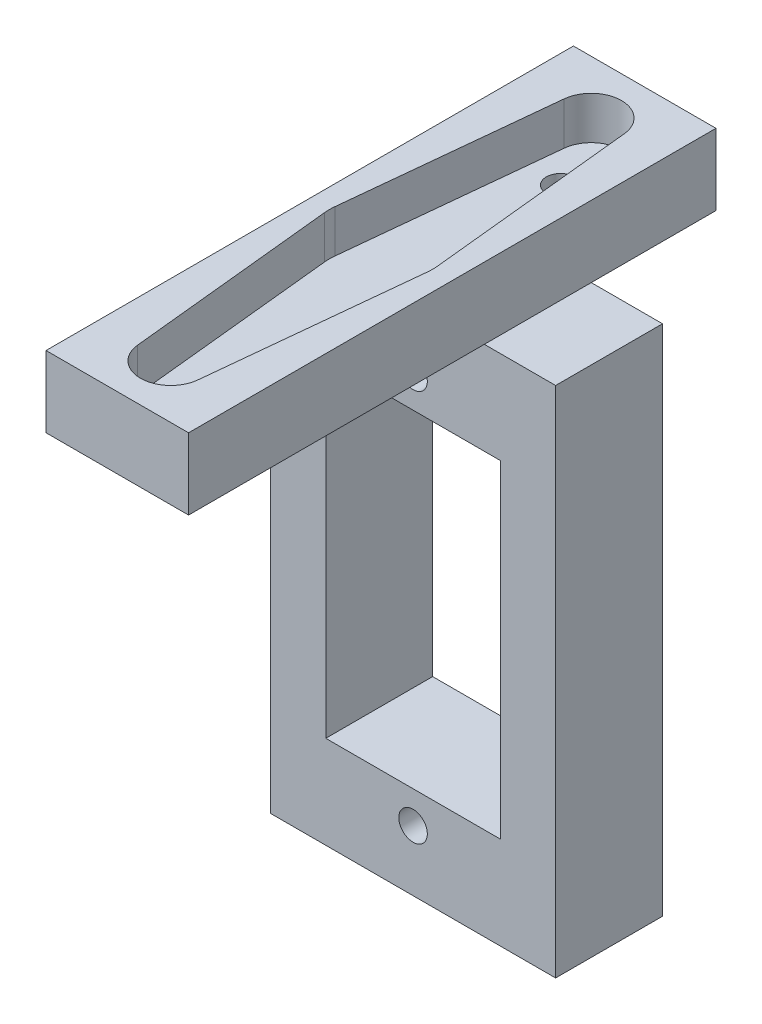
ISO-10303-21;
HEADER;
FILE_DESCRIPTION(('STEP AP214'),'2;1');
FILE_NAME('part.step','',(''),(''),'','','');
FILE_SCHEMA(('AUTOMOTIVE_DESIGN { 1 0 10303 214 1 1 1 1 }'));
ENDSEC;
DATA;
#1=APPLICATION_CONTEXT('core data for automotive mechanical design processes');
#2=APPLICATION_PROTOCOL_DEFINITION('international standard','automotive_design',2000,#1);
#3=PRODUCT_CONTEXT('',#1,'mechanical');
#4=PRODUCT('Part','Part','',(#3));
#5=PRODUCT_RELATED_PRODUCT_CATEGORY('part','',(#4));
#6=PRODUCT_DEFINITION_FORMATION('','',#4);
#7=PRODUCT_DEFINITION_CONTEXT('part definition',#1,'design');
#8=PRODUCT_DEFINITION('design','',#6,#7);
#9=PRODUCT_DEFINITION_SHAPE('','',#8);
#10=(LENGTH_UNIT() NAMED_UNIT(*) SI_UNIT(.MILLI.,.METRE.));
#11=(NAMED_UNIT(*) PLANE_ANGLE_UNIT() SI_UNIT($,.RADIAN.));
#12=(NAMED_UNIT(*) SI_UNIT($,.STERADIAN.) SOLID_ANGLE_UNIT());
#13=UNCERTAINTY_MEASURE_WITH_UNIT(LENGTH_MEASURE(1.E-05),#10,'distance_accuracy_value','');
#14=(GEOMETRIC_REPRESENTATION_CONTEXT(3) GLOBAL_UNCERTAINTY_ASSIGNED_CONTEXT((#13)) GLOBAL_UNIT_ASSIGNED_CONTEXT((#10,
#11,#12)) REPRESENTATION_CONTEXT('',''));
#15=CARTESIAN_POINT('',(0.,0.,0.));
#16=DIRECTION('',(0.,0.,1.));
#17=DIRECTION('',(1.,0.,0.));
#18=AXIS2_PLACEMENT_3D('',#15,#16,#17);
#19=CARTESIAN_POINT('',(0.,-5.,0.));
#20=DIRECTION('',(0.,1.,0.));
#21=DIRECTION('',(0.,0.,1.));
#22=AXIS2_PLACEMENT_3D('',#19,#20,#21);
#23=PLANE('',#22);
#24=CARTESIAN_POINT('',(0.,-5.,-12.6));
#25=DIRECTION('',(0.,1.,0.));
#26=DIRECTION('',(0.,0.,1.));
#27=AXIS2_PLACEMENT_3D('',#24,#25,#26);
#28=CIRCLE('',#27,1.);
#29=CARTESIAN_POINT('',(0.,-5.,-11.6));
#30=VERTEX_POINT('',#29);
#31=EDGE_CURVE('E679',#30,#30,#28,.F.);
#32=ORIENTED_EDGE('',*,*,#31,.F.);
#33=EDGE_LOOP('',(#32));
#34=FACE_BOUND('',#33,.T.);
#35=DIRECTION('',(1.,0.,0.));
#36=VECTOR('',#35,1.);
#37=CARTESIAN_POINT('',(-10.,-5.,-9.75));
#38=LINE('',#37,#36);
#39=CARTESIAN_POINT('',(-5.,-5.,-9.75));
#40=VERTEX_POINT('',#39);
#41=CARTESIAN_POINT('',(5.,-5.,-9.75));
#42=VERTEX_POINT('',#41);
#43=EDGE_CURVE('E236',#40,#42,#38,.T.);
#44=ORIENTED_EDGE('',*,*,#43,.F.);
#45=DIRECTION('',(0.,0.,1.));
#46=VECTOR('',#45,1.);
#47=CARTESIAN_POINT('',(-5.,-5.,-18.5));
#48=LINE('',#47,#46);
#49=CARTESIAN_POINT('',(-5.,-5.,-18.5));
#50=VERTEX_POINT('',#49);
#51=EDGE_CURVE('E322',#50,#40,#48,.T.);
#52=ORIENTED_EDGE('',*,*,#51,.F.);
#53=DIRECTION('',(-1.,0.,0.));
#54=VECTOR('',#53,1.);
#55=CARTESIAN_POINT('',(-5.,-5.,-18.5));
#56=LINE('',#55,#54);
#57=CARTESIAN_POINT('',(5.,-5.,-18.5));
#58=VERTEX_POINT('',#57);
#59=EDGE_CURVE('E316',#58,#50,#56,.T.);
#60=ORIENTED_EDGE('',*,*,#59,.F.);
#61=DIRECTION('',(0.,0.,-1.));
#62=VECTOR('',#61,1.);
#63=CARTESIAN_POINT('',(5.,-5.,-18.5));
#64=LINE('',#63,#62);
#65=EDGE_CURVE('E318',#42,#58,#64,.T.);
#66=ORIENTED_EDGE('',*,*,#65,.F.);
#67=EDGE_LOOP('',(#44,#52,#60,#66));
#68=FACE_BOUND('',#67,.T.);
#69=ADVANCED_FACE('F35',(#34,#68),#23,.F.);
#70=CARTESIAN_POINT('',(0.,-5.,12.6));
#71=DIRECTION('',(0.,1.,0.));
#72=DIRECTION('',(0.,0.,1.));
#73=AXIS2_PLACEMENT_3D('',#70,#71,#72);
#74=CIRCLE('',#73,1.);
#75=CARTESIAN_POINT('',(0.,-5.,13.6));
#76=VERTEX_POINT('',#75);
#77=EDGE_CURVE('E673',#76,#76,#74,.F.);
#78=ORIENTED_EDGE('',*,*,#77,.F.);
#79=EDGE_LOOP('',(#78));
#80=FACE_BOUND('',#79,.T.);
#81=DIRECTION('',(-1.,0.,0.));
#82=VECTOR('',#81,1.);
#83=CARTESIAN_POINT('',(-10.,-5.,-2.25));
#84=LINE('',#83,#82);
#85=CARTESIAN_POINT('',(5.,-5.,-2.25));
#86=VERTEX_POINT('',#85);
#87=CARTESIAN_POINT('',(-5.,-5.,-2.25));
#88=VERTEX_POINT('',#87);
#89=EDGE_CURVE('E231',#86,#88,#84,.T.);
#90=ORIENTED_EDGE('',*,*,#89,.F.);
#91=CARTESIAN_POINT('',(5.,-5.,18.5));
#92=VERTEX_POINT('',#91);
#93=EDGE_CURVE('E313',#92,#86,#64,.T.);
#94=ORIENTED_EDGE('',*,*,#93,.F.);
#95=DIRECTION('',(1.,0.,0.));
#96=VECTOR('',#95,1.);
#97=CARTESIAN_POINT('',(-5.,-5.,18.5));
#98=LINE('',#97,#96);
#99=CARTESIAN_POINT('',(-5.,-5.,18.5));
#100=VERTEX_POINT('',#99);
#101=EDGE_CURVE('E325',#100,#92,#98,.T.);
#102=ORIENTED_EDGE('',*,*,#101,.F.);
#103=EDGE_CURVE('E321',#88,#100,#48,.T.);
#104=ORIENTED_EDGE('',*,*,#103,.F.);
#105=EDGE_LOOP('',(#90,#94,#102,#104));
#106=FACE_BOUND('',#105,.T.);
#107=ADVANCED_FACE('F373',(#80,#106),#23,.F.);
#108=CARTESIAN_POINT('',(5.,-5.,-18.5));
#109=DIRECTION('',(1.,0.,0.));
#110=DIRECTION('',(0.,0.,-1.));
#111=AXIS2_PLACEMENT_3D('',#108,#109,#110);
#112=PLANE('',#111);
#113=DIRECTION('',(0.,0.,-1.));
#114=VECTOR('',#113,1.);
#115=CARTESIAN_POINT('',(5.,0.,-18.5));
#116=LINE('',#115,#114);
#117=CARTESIAN_POINT('',(5.,0.,18.5));
#118=VERTEX_POINT('',#117);
#119=CARTESIAN_POINT('',(5.,0.,-18.5));
#120=VERTEX_POINT('',#119);
#121=EDGE_CURVE('E298',#118,#120,#116,.T.);
#122=ORIENTED_EDGE('',*,*,#121,.F.);
#123=DIRECTION('',(0.,1.,0.));
#124=VECTOR('',#123,1.);
#125=CARTESIAN_POINT('',(5.,-5.,18.5));
#126=LINE('',#125,#124);
#127=EDGE_CURVE('E341',#92,#118,#126,.T.);
#128=ORIENTED_EDGE('',*,*,#127,.F.);
#129=ORIENTED_EDGE('',*,*,#93,.T.);
#130=EDGE_CURVE('E317',#86,#42,#64,.T.);
#131=ORIENTED_EDGE('',*,*,#130,.T.);
#132=ORIENTED_EDGE('',*,*,#65,.T.);
#133=DIRECTION('',(0.,1.,0.));
#134=VECTOR('',#133,1.);
#135=CARTESIAN_POINT('',(5.,-5.,-18.5));
#136=LINE('',#135,#134);
#137=EDGE_CURVE('E329',#58,#120,#136,.T.);
#138=ORIENTED_EDGE('',*,*,#137,.T.);
#139=EDGE_LOOP('',(#122,#128,#129,#131,#132,#138));
#140=FACE_BOUND('',#139,.T.);
#141=ADVANCED_FACE('F37',(#140),#112,.T.);
#142=CARTESIAN_POINT('',(-5.,-5.,18.5));
#143=DIRECTION('',(0.,0.,1.));
#144=DIRECTION('',(1.,0.,0.));
#145=AXIS2_PLACEMENT_3D('',#142,#143,#144);
#146=PLANE('',#145);
#147=DIRECTION('',(1.,0.,0.));
#148=VECTOR('',#147,1.);
#149=CARTESIAN_POINT('',(-5.,0.,18.5));
#150=LINE('',#149,#148);
#151=CARTESIAN_POINT('',(-5.,0.,18.5));
#152=VERTEX_POINT('',#151);
#153=EDGE_CURVE('E338',#152,#118,#150,.T.);
#154=ORIENTED_EDGE('',*,*,#153,.F.);
#155=DIRECTION('',(0.,1.,0.));
#156=VECTOR('',#155,1.);
#157=CARTESIAN_POINT('',(-5.,-5.,18.5));
#158=LINE('',#157,#156);
#159=EDGE_CURVE('E343',#100,#152,#158,.T.);
#160=ORIENTED_EDGE('',*,*,#159,.F.);
#161=ORIENTED_EDGE('',*,*,#101,.T.);
#162=ORIENTED_EDGE('',*,*,#127,.T.);
#163=EDGE_LOOP('',(#154,#160,#161,#162));
#164=FACE_BOUND('',#163,.T.);
#165=ADVANCED_FACE('F392',(#164),#146,.T.);
#166=CARTESIAN_POINT('',(-5.,-5.,-18.5));
#167=DIRECTION('',(-1.,0.,0.));
#168=DIRECTION('',(0.,0.,1.));
#169=AXIS2_PLACEMENT_3D('',#166,#167,#168);
#170=PLANE('',#169);
#171=DIRECTION('',(0.,0.,1.));
#172=VECTOR('',#171,1.);
#173=CARTESIAN_POINT('',(-5.,0.,-18.5));
#174=LINE('',#173,#172);
#175=CARTESIAN_POINT('',(-5.,0.,-18.5));
#176=VERTEX_POINT('',#175);
#177=EDGE_CURVE('E335',#176,#152,#174,.T.);
#178=ORIENTED_EDGE('',*,*,#177,.F.);
#179=DIRECTION('',(0.,1.,0.));
#180=VECTOR('',#179,1.);
#181=CARTESIAN_POINT('',(-5.,-5.,-18.5));
#182=LINE('',#181,#180);
#183=EDGE_CURVE('E345',#50,#176,#182,.T.);
#184=ORIENTED_EDGE('',*,*,#183,.F.);
#185=ORIENTED_EDGE('',*,*,#51,.T.);
#186=EDGE_CURVE('E326',#40,#88,#48,.T.);
#187=ORIENTED_EDGE('',*,*,#186,.T.);
#188=ORIENTED_EDGE('',*,*,#103,.T.);
#189=ORIENTED_EDGE('',*,*,#159,.T.);
#190=EDGE_LOOP('',(#178,#184,#185,#187,#188,#189));
#191=FACE_BOUND('',#190,.T.);
#192=ADVANCED_FACE('F395',(#191),#170,.T.);
#193=CARTESIAN_POINT('',(-5.,-5.,-18.5));
#194=DIRECTION('',(0.,0.,-1.));
#195=DIRECTION('',(-1.,0.,0.));
#196=AXIS2_PLACEMENT_3D('',#193,#194,#195);
#197=PLANE('',#196);
#198=DIRECTION('',(-1.,0.,0.));
#199=VECTOR('',#198,1.);
#200=CARTESIAN_POINT('',(-5.,0.,-18.5));
#201=LINE('',#200,#199);
#202=EDGE_CURVE('E332',#120,#176,#201,.T.);
#203=ORIENTED_EDGE('',*,*,#202,.F.);
#204=ORIENTED_EDGE('',*,*,#137,.F.);
#205=ORIENTED_EDGE('',*,*,#59,.T.);
#206=ORIENTED_EDGE('',*,*,#183,.T.);
#207=EDGE_LOOP('',(#203,#204,#205,#206));
#208=FACE_BOUND('',#207,.T.);
#209=ADVANCED_FACE('F390',(#208),#197,.T.);
#210=CARTESIAN_POINT('',(0.,0.,0.));
#211=DIRECTION('',(0.,1.,0.));
#212=DIRECTION('',(0.,0.,1.));
#213=AXIS2_PLACEMENT_3D('',#210,#211,#212);
#214=PLANE('',#213);
#215=CARTESIAN_POINT('',(0.,0.,-14.75));
#216=DIRECTION('',(0.,1.,0.));
#217=DIRECTION('',(0.,0.,1.));
#218=AXIS2_PLACEMENT_3D('',#215,#216,#217);
#219=CIRCLE('',#218,2.125);
#220=CARTESIAN_POINT('',(2.11398322071267,0.,-14.9661016949153));
#221=VERTEX_POINT('',#220);
#222=CARTESIAN_POINT('',(-2.11398322071268,0.,-14.9661016949153));
#223=VERTEX_POINT('',#222);
#224=EDGE_CURVE('E248',#221,#223,#219,.T.);
#225=ORIENTED_EDGE('',*,*,#224,.F.);
#226=DIRECTION('',(-0.101694915254238,0.,-0.994815633276555));
#227=VECTOR('',#226,1.);
#228=CARTESIAN_POINT('',(2.11398322071267,0.,-14.9661016949153));
#229=LINE('',#228,#227);
#230=CARTESIAN_POINT('',(3.60620667062751,0.,-0.36864406779661));
#231=VERTEX_POINT('',#230);
#232=EDGE_CURVE('E253',#231,#221,#229,.T.);
#233=ORIENTED_EDGE('',*,*,#232,.F.);
#234=CARTESIAN_POINT('',(0.,0.,0.));
#235=DIRECTION('',(0.,1.,0.));
#236=DIRECTION('',(0.,0.,1.));
#237=AXIS2_PLACEMENT_3D('',#234,#235,#236);
#238=CIRCLE('',#237,3.625);
#239=CARTESIAN_POINT('',(3.60620667062751,0.,0.368644067796603));
#240=VERTEX_POINT('',#239);
#241=EDGE_CURVE('E291',#240,#231,#238,.T.);
#242=ORIENTED_EDGE('',*,*,#241,.F.);
#243=DIRECTION('',(0.101694915254238,0.,-0.994815633276555));
#244=VECTOR('',#243,1.);
#245=CARTESIAN_POINT('',(2.11398322071267,0.,14.9661016949152));
#246=LINE('',#245,#244);
#247=CARTESIAN_POINT('',(2.11398322071268,0.,14.9661016949152));
#248=VERTEX_POINT('',#247);
#249=EDGE_CURVE('E288',#248,#240,#246,.T.);
#250=ORIENTED_EDGE('',*,*,#249,.F.);
#251=CARTESIAN_POINT('',(0.,0.,14.75));
#252=DIRECTION('',(0.,1.,0.));
#253=DIRECTION('',(0.,0.,-1.));
#254=AXIS2_PLACEMENT_3D('',#251,#252,#253);
#255=CIRCLE('',#254,2.125);
#256=CARTESIAN_POINT('',(-2.11398322071268,0.,14.9661016949152));
#257=VERTEX_POINT('',#256);
#258=EDGE_CURVE('E285',#257,#248,#255,.T.);
#259=ORIENTED_EDGE('',*,*,#258,.F.);
#260=DIRECTION('',(0.101694915254237,0.,0.994815633276555));
#261=VECTOR('',#260,1.);
#262=CARTESIAN_POINT('',(-2.11398322071268,0.,14.9661016949152));
#263=LINE('',#262,#261);
#264=CARTESIAN_POINT('',(-3.60620667062751,0.,0.368644067796602));
#265=VERTEX_POINT('',#264);
#266=EDGE_CURVE('E282',#265,#257,#263,.T.);
#267=ORIENTED_EDGE('',*,*,#266,.F.);
#268=CARTESIAN_POINT('',(0.,0.,0.));
#269=DIRECTION('',(0.,1.,0.));
#270=DIRECTION('',(0.,0.,1.));
#271=AXIS2_PLACEMENT_3D('',#268,#269,#270);
#272=CIRCLE('',#271,3.625);
#273=CARTESIAN_POINT('',(-3.60620667062751,0.,-0.36864406779661));
#274=VERTEX_POINT('',#273);
#275=EDGE_CURVE('E279',#274,#265,#272,.T.);
#276=ORIENTED_EDGE('',*,*,#275,.F.);
#277=DIRECTION('',(-0.101694915254237,0.,0.994815633276555));
#278=VECTOR('',#277,1.);
#279=CARTESIAN_POINT('',(-2.11398322071268,0.,-14.9661016949153));
#280=LINE('',#279,#278);
#281=EDGE_CURVE('E276',#223,#274,#280,.T.);
#282=ORIENTED_EDGE('',*,*,#281,.F.);
#283=EDGE_LOOP('',(#225,#233,#242,#250,#259,#267,#276,#282));
#284=FACE_BOUND('',#283,.T.);
#285=ORIENTED_EDGE('',*,*,#121,.T.);
#286=ORIENTED_EDGE('',*,*,#202,.T.);
#287=ORIENTED_EDGE('',*,*,#177,.T.);
#288=ORIENTED_EDGE('',*,*,#153,.T.);
#289=EDGE_LOOP('',(#285,#286,#287,#288));
#290=FACE_BOUND('',#289,.T.);
#291=ADVANCED_FACE('F387',(#284,#290),#214,.T.);
#292=CARTESIAN_POINT('',(0.,-3.,-14.75));
#293=DIRECTION('',(0.,1.,0.));
#294=DIRECTION('',(0.,0.,1.));
#295=AXIS2_PLACEMENT_3D('',#292,#293,#294);
#296=CYLINDRICAL_SURFACE('',#295,2.125);
#297=ORIENTED_EDGE('',*,*,#224,.T.);
#298=DIRECTION('',(0.,1.,0.));
#299=VECTOR('',#298,1.);
#300=CARTESIAN_POINT('',(-2.11398322071268,-3.,-14.9661016949153));
#301=LINE('',#300,#299);
#302=CARTESIAN_POINT('',(-2.11398322071268,-3.,-14.9661016949153));
#303=VERTEX_POINT('',#302);
#304=EDGE_CURVE('E274',#303,#223,#301,.T.);
#305=ORIENTED_EDGE('',*,*,#304,.F.);
#306=CARTESIAN_POINT('',(0.,-3.,-14.75));
#307=DIRECTION('',(0.,1.,0.));
#308=DIRECTION('',(0.,0.,1.));
#309=AXIS2_PLACEMENT_3D('',#306,#307,#308);
#310=CIRCLE('',#309,2.125);
#311=CARTESIAN_POINT('',(2.11398322071267,-3.,-14.9661016949153));
#312=VERTEX_POINT('',#311);
#313=EDGE_CURVE('E249',#312,#303,#310,.T.);
#314=ORIENTED_EDGE('',*,*,#313,.F.);
#315=DIRECTION('',(0.,1.,0.));
#316=VECTOR('',#315,1.);
#317=CARTESIAN_POINT('',(2.11398322071267,-3.,-14.9661016949153));
#318=LINE('',#317,#316);
#319=EDGE_CURVE('E296',#312,#221,#318,.T.);
#320=ORIENTED_EDGE('',*,*,#319,.T.);
#321=EDGE_LOOP('',(#297,#305,#314,#320));
#322=FACE_BOUND('',#321,.T.);
#323=ADVANCED_FACE('F385',(#322),#296,.F.);
#324=CARTESIAN_POINT('',(2.11398322071267,-3.,-14.9661016949153));
#325=DIRECTION('',(0.994815633276555,0.,-0.101694915254238));
#326=DIRECTION('',(-0.101694915254238,0.,-0.994815633276555));
#327=AXIS2_PLACEMENT_3D('',#324,#325,#326);
#328=PLANE('',#327);
#329=ORIENTED_EDGE('',*,*,#232,.T.);
#330=ORIENTED_EDGE('',*,*,#319,.F.);
#331=DIRECTION('',(-0.101694915254238,0.,-0.994815633276555));
#332=VECTOR('',#331,1.);
#333=CARTESIAN_POINT('',(2.11398322071267,-3.,-14.9661016949153));
#334=LINE('',#333,#332);
#335=CARTESIAN_POINT('',(3.60620667062751,-3.,-0.36864406779661));
#336=VERTEX_POINT('',#335);
#337=EDGE_CURVE('E271',#336,#312,#334,.T.);
#338=ORIENTED_EDGE('',*,*,#337,.F.);
#339=DIRECTION('',(0.,1.,0.));
#340=VECTOR('',#339,1.);
#341=CARTESIAN_POINT('',(3.60620667062751,-3.,-0.36864406779661));
#342=LINE('',#341,#340);
#343=EDGE_CURVE('E299',#336,#231,#342,.T.);
#344=ORIENTED_EDGE('',*,*,#343,.T.);
#345=EDGE_LOOP('',(#329,#330,#338,#344));
#346=FACE_BOUND('',#345,.T.);
#347=ADVANCED_FACE('F456',(#346),#328,.F.);
#348=CARTESIAN_POINT('',(0.,-3.,0.));
#349=DIRECTION('',(0.,1.,0.));
#350=DIRECTION('',(0.,0.,1.));
#351=AXIS2_PLACEMENT_3D('',#348,#349,#350);
#352=CYLINDRICAL_SURFACE('',#351,3.625);
#353=ORIENTED_EDGE('',*,*,#241,.T.);
#354=ORIENTED_EDGE('',*,*,#343,.F.);
#355=CARTESIAN_POINT('',(0.,-3.,0.));
#356=DIRECTION('',(0.,1.,0.));
#357=DIRECTION('',(0.,0.,1.));
#358=AXIS2_PLACEMENT_3D('',#355,#356,#357);
#359=CIRCLE('',#358,3.625);
#360=CARTESIAN_POINT('',(3.60620667062751,-3.,0.368644067796603));
#361=VERTEX_POINT('',#360);
#362=EDGE_CURVE('E268',#361,#336,#359,.T.);
#363=ORIENTED_EDGE('',*,*,#362,.F.);
#364=DIRECTION('',(0.,1.,0.));
#365=VECTOR('',#364,1.);
#366=CARTESIAN_POINT('',(3.60620667062751,-3.,0.368644067796603));
#367=LINE('',#366,#365);
#368=EDGE_CURVE('E301',#361,#240,#367,.T.);
#369=ORIENTED_EDGE('',*,*,#368,.T.);
#370=EDGE_LOOP('',(#353,#354,#363,#369));
#371=FACE_BOUND('',#370,.T.);
#372=ADVANCED_FACE('F459',(#371),#352,.F.);
#373=CARTESIAN_POINT('',(2.11398322071267,-3.,14.9661016949152));
#374=DIRECTION('',(0.994815633276555,0.,0.101694915254238));
#375=DIRECTION('',(0.101694915254238,0.,-0.994815633276555));
#376=AXIS2_PLACEMENT_3D('',#373,#374,#375);
#377=PLANE('',#376);
#378=ORIENTED_EDGE('',*,*,#249,.T.);
#379=ORIENTED_EDGE('',*,*,#368,.F.);
#380=DIRECTION('',(0.101694915254238,0.,-0.994815633276555));
#381=VECTOR('',#380,1.);
#382=CARTESIAN_POINT('',(2.11398322071267,-3.,14.9661016949152));
#383=LINE('',#382,#381);
#384=CARTESIAN_POINT('',(2.11398322071268,-3.,14.9661016949152));
#385=VERTEX_POINT('',#384);
#386=EDGE_CURVE('E265',#385,#361,#383,.T.);
#387=ORIENTED_EDGE('',*,*,#386,.F.);
#388=DIRECTION('',(0.,1.,0.));
#389=VECTOR('',#388,1.);
#390=CARTESIAN_POINT('',(2.11398322071268,-3.,14.9661016949152));
#391=LINE('',#390,#389);
#392=EDGE_CURVE('E303',#385,#248,#391,.T.);
#393=ORIENTED_EDGE('',*,*,#392,.T.);
#394=EDGE_LOOP('',(#378,#379,#387,#393));
#395=FACE_BOUND('',#394,.T.);
#396=ADVANCED_FACE('F463',(#395),#377,.F.);
#397=CARTESIAN_POINT('',(0.,-3.,14.75));
#398=DIRECTION('',(0.,1.,0.));
#399=DIRECTION('',(0.,0.,1.));
#400=AXIS2_PLACEMENT_3D('',#397,#398,#399);
#401=CYLINDRICAL_SURFACE('',#400,2.125);
#402=ORIENTED_EDGE('',*,*,#258,.T.);
#403=ORIENTED_EDGE('',*,*,#392,.F.);
#404=CARTESIAN_POINT('',(0.,-3.,14.75));
#405=DIRECTION('',(0.,1.,0.));
#406=DIRECTION('',(0.,0.,-1.));
#407=AXIS2_PLACEMENT_3D('',#404,#405,#406);
#408=CIRCLE('',#407,2.125);
#409=CARTESIAN_POINT('',(-2.11398322071268,-3.,14.9661016949152));
#410=VERTEX_POINT('',#409);
#411=EDGE_CURVE('E262',#410,#385,#408,.T.);
#412=ORIENTED_EDGE('',*,*,#411,.F.);
#413=DIRECTION('',(0.,1.,0.));
#414=VECTOR('',#413,1.);
#415=CARTESIAN_POINT('',(-2.11398322071268,-3.,14.9661016949152));
#416=LINE('',#415,#414);
#417=EDGE_CURVE('E305',#410,#257,#416,.T.);
#418=ORIENTED_EDGE('',*,*,#417,.T.);
#419=EDGE_LOOP('',(#402,#403,#412,#418));
#420=FACE_BOUND('',#419,.T.);
#421=ADVANCED_FACE('F467',(#420),#401,.F.);
#422=CARTESIAN_POINT('',(-2.11398322071268,-3.,14.9661016949152));
#423=DIRECTION('',(-0.994815633276555,0.,0.101694915254237));
#424=DIRECTION('',(0.101694915254237,0.,0.994815633276555));
#425=AXIS2_PLACEMENT_3D('',#422,#423,#424);
#426=PLANE('',#425);
#427=ORIENTED_EDGE('',*,*,#266,.T.);
#428=ORIENTED_EDGE('',*,*,#417,.F.);
#429=DIRECTION('',(0.101694915254237,0.,0.994815633276555));
#430=VECTOR('',#429,1.);
#431=CARTESIAN_POINT('',(-2.11398322071268,-3.,14.9661016949152));
#432=LINE('',#431,#430);
#433=CARTESIAN_POINT('',(-3.60620667062751,-3.,0.368644067796602));
#434=VERTEX_POINT('',#433);
#435=EDGE_CURVE('E259',#434,#410,#432,.T.);
#436=ORIENTED_EDGE('',*,*,#435,.F.);
#437=DIRECTION('',(0.,1.,0.));
#438=VECTOR('',#437,1.);
#439=CARTESIAN_POINT('',(-3.60620667062751,-3.,0.368644067796602));
#440=LINE('',#439,#438);
#441=EDGE_CURVE('E307',#434,#265,#440,.T.);
#442=ORIENTED_EDGE('',*,*,#441,.T.);
#443=EDGE_LOOP('',(#427,#428,#436,#442));
#444=FACE_BOUND('',#443,.T.);
#445=ADVANCED_FACE('F471',(#444),#426,.F.);
#446=CARTESIAN_POINT('',(0.,-3.,0.));
#447=DIRECTION('',(0.,1.,0.));
#448=DIRECTION('',(0.,0.,1.));
#449=AXIS2_PLACEMENT_3D('',#446,#447,#448);
#450=CYLINDRICAL_SURFACE('',#449,3.625);
#451=ORIENTED_EDGE('',*,*,#275,.T.);
#452=ORIENTED_EDGE('',*,*,#441,.F.);
#453=CARTESIAN_POINT('',(0.,-3.,0.));
#454=DIRECTION('',(0.,1.,0.));
#455=DIRECTION('',(0.,0.,1.));
#456=AXIS2_PLACEMENT_3D('',#453,#454,#455);
#457=CIRCLE('',#456,3.625);
#458=CARTESIAN_POINT('',(-3.60620667062751,-3.,-0.36864406779661));
#459=VERTEX_POINT('',#458);
#460=EDGE_CURVE('E256',#459,#434,#457,.T.);
#461=ORIENTED_EDGE('',*,*,#460,.F.);
#462=DIRECTION('',(0.,1.,0.));
#463=VECTOR('',#462,1.);
#464=CARTESIAN_POINT('',(-3.60620667062751,-3.,-0.36864406779661));
#465=LINE('',#464,#463);
#466=EDGE_CURVE('E309',#459,#274,#465,.T.);
#467=ORIENTED_EDGE('',*,*,#466,.T.);
#468=EDGE_LOOP('',(#451,#452,#461,#467));
#469=FACE_BOUND('',#468,.T.);
#470=ADVANCED_FACE('F475',(#469),#450,.F.);
#471=CARTESIAN_POINT('',(-2.11398322071268,-3.,-14.9661016949153));
#472=DIRECTION('',(-0.994815633276555,0.,-0.101694915254237));
#473=DIRECTION('',(-0.101694915254237,0.,0.994815633276555));
#474=AXIS2_PLACEMENT_3D('',#471,#472,#473);
#475=PLANE('',#474);
#476=ORIENTED_EDGE('',*,*,#281,.T.);
#477=ORIENTED_EDGE('',*,*,#466,.F.);
#478=DIRECTION('',(-0.101694915254237,0.,0.994815633276555));
#479=VECTOR('',#478,1.);
#480=CARTESIAN_POINT('',(-2.11398322071268,-3.,-14.9661016949153));
#481=LINE('',#480,#479);
#482=EDGE_CURVE('E252',#303,#459,#481,.T.);
#483=ORIENTED_EDGE('',*,*,#482,.F.);
#484=ORIENTED_EDGE('',*,*,#304,.T.);
#485=EDGE_LOOP('',(#476,#477,#483,#484));
#486=FACE_BOUND('',#485,.T.);
#487=ADVANCED_FACE('F444',(#486),#475,.F.);
#488=CARTESIAN_POINT('',(0.,-3.,-14.75));
#489=DIRECTION('',(0.,1.,0.));
#490=DIRECTION('',(0.,0.,1.));
#491=AXIS2_PLACEMENT_3D('',#488,#489,#490);
#492=PLANE('',#491);
#493=CARTESIAN_POINT('',(0.,-3.,12.6));
#494=DIRECTION('',(0.,1.,0.));
#495=DIRECTION('',(0.,0.,-1.));
#496=AXIS2_PLACEMENT_3D('',#493,#494,#495);
#497=CIRCLE('',#496,1.);
#498=CARTESIAN_POINT('',(0.,-3.,11.6));
#499=VERTEX_POINT('',#498);
#500=EDGE_CURVE('E670',#499,#499,#497,.T.);
#501=ORIENTED_EDGE('',*,*,#500,.F.);
#502=EDGE_LOOP('',(#501));
#503=FACE_BOUND('',#502,.T.);
#504=CARTESIAN_POINT('',(0.,-3.,-12.6));
#505=DIRECTION('',(0.,1.,0.));
#506=DIRECTION('',(0.,0.,1.));
#507=AXIS2_PLACEMENT_3D('',#504,#505,#506);
#508=CIRCLE('',#507,1.);
#509=CARTESIAN_POINT('',(0.,-3.,-11.6));
#510=VERTEX_POINT('',#509);
#511=EDGE_CURVE('E676',#510,#510,#508,.T.);
#512=ORIENTED_EDGE('',*,*,#511,.F.);
#513=EDGE_LOOP('',(#512));
#514=FACE_BOUND('',#513,.T.);
#515=ORIENTED_EDGE('',*,*,#313,.T.);
#516=ORIENTED_EDGE('',*,*,#482,.T.);
#517=ORIENTED_EDGE('',*,*,#460,.T.);
#518=ORIENTED_EDGE('',*,*,#435,.T.);
#519=ORIENTED_EDGE('',*,*,#411,.T.);
#520=ORIENTED_EDGE('',*,*,#386,.T.);
#521=ORIENTED_EDGE('',*,*,#362,.T.);
#522=ORIENTED_EDGE('',*,*,#337,.T.);
#523=EDGE_LOOP('',(#515,#516,#517,#518,#519,#520,#521,#522));
#524=FACE_BOUND('',#523,.T.);
#525=ADVANCED_FACE('F437',(#503,#514,#524),#492,.T.);
#526=CARTESIAN_POINT('',(0.,-5.,0.));
#527=DIRECTION('',(0.,-1.,0.));
#528=DIRECTION('',(0.,0.,-1.));
#529=AXIS2_PLACEMENT_3D('',#526,#527,#528);
#530=PLANE('',#529);
#531=ORIENTED_EDGE('',*,*,#130,.F.);
#532=CARTESIAN_POINT('',(9.99999999999999,-5.,-2.25));
#533=VERTEX_POINT('',#532);
#534=EDGE_CURVE('E227',#533,#86,#84,.T.);
#535=ORIENTED_EDGE('',*,*,#534,.F.);
#536=DIRECTION('',(0.,0.,1.));
#537=VECTOR('',#536,1.);
#538=CARTESIAN_POINT('',(9.99999999999999,-5.,-2.25));
#539=LINE('',#538,#537);
#540=CARTESIAN_POINT('',(9.99999999999999,-5.,-9.75));
#541=VERTEX_POINT('',#540);
#542=EDGE_CURVE('E210',#541,#533,#539,.T.);
#543=ORIENTED_EDGE('',*,*,#542,.F.);
#544=EDGE_CURVE('E233',#42,#541,#38,.T.);
#545=ORIENTED_EDGE('',*,*,#544,.F.);
#546=EDGE_LOOP('',(#531,#535,#543,#545));
#547=FACE_BOUND('',#546,.T.);
#548=ADVANCED_FACE('F369',(#547),#530,.F.);
#549=CARTESIAN_POINT('',(9.99999999999999,-41.,-2.25));
#550=DIRECTION('',(-1.,0.,0.));
#551=DIRECTION('',(0.,0.,1.));
#552=AXIS2_PLACEMENT_3D('',#549,#550,#551);
#553=PLANE('',#552);
#554=ORIENTED_EDGE('',*,*,#542,.T.);
#555=DIRECTION('',(0.,1.,0.));
#556=VECTOR('',#555,1.);
#557=CARTESIAN_POINT('',(9.99999999999999,-41.,-2.25));
#558=LINE('',#557,#556);
#559=CARTESIAN_POINT('',(9.99999999999999,-41.,-2.25));
#560=VERTEX_POINT('',#559);
#561=EDGE_CURVE('E245',#560,#533,#558,.T.);
#562=ORIENTED_EDGE('',*,*,#561,.F.);
#563=DIRECTION('',(0.,0.,1.));
#564=VECTOR('',#563,1.);
#565=CARTESIAN_POINT('',(9.99999999999999,-41.,-2.25));
#566=LINE('',#565,#564);
#567=CARTESIAN_POINT('',(9.99999999999999,-41.,-9.75));
#568=VERTEX_POINT('',#567);
#569=EDGE_CURVE('E213',#568,#560,#566,.T.);
#570=ORIENTED_EDGE('',*,*,#569,.F.);
#571=DIRECTION('',(0.,1.,0.));
#572=VECTOR('',#571,1.);
#573=CARTESIAN_POINT('',(9.99999999999999,-41.,-9.75));
#574=LINE('',#573,#572);
#575=EDGE_CURVE('E223',#568,#541,#574,.T.);
#576=ORIENTED_EDGE('',*,*,#575,.T.);
#577=EDGE_LOOP('',(#554,#562,#570,#576));
#578=FACE_BOUND('',#577,.T.);
#579=ADVANCED_FACE('F434',(#578),#553,.F.);
#580=CARTESIAN_POINT('',(-10.,-41.,-2.25));
#581=DIRECTION('',(0.,0.,-1.));
#582=DIRECTION('',(-1.,0.,0.));
#583=AXIS2_PLACEMENT_3D('',#580,#581,#582);
#584=PLANE('',#583);
#585=CARTESIAN_POINT('',(0.,-36.75,-2.25));
#586=DIRECTION('',(0.,0.,-1.));
#587=DIRECTION('',(-1.,0.,0.));
#588=AXIS2_PLACEMENT_3D('',#585,#586,#587);
#589=CIRCLE('',#588,1.);
#590=CARTESIAN_POINT('',(-1.,-36.75,-2.25));
#591=VERTEX_POINT('',#590);
#592=EDGE_CURVE('E660',#591,#591,#589,.F.);
#593=ORIENTED_EDGE('',*,*,#592,.F.);
#594=EDGE_LOOP('',(#593));
#595=FACE_BOUND('',#594,.T.);
#596=CARTESIAN_POINT('',(0.,-9.25,-2.25));
#597=DIRECTION('',(0.,0.,-1.));
#598=DIRECTION('',(-1.,0.,0.));
#599=AXIS2_PLACEMENT_3D('',#596,#597,#598);
#600=CIRCLE('',#599,1.);
#601=CARTESIAN_POINT('',(-1.,-9.25,-2.25));
#602=VERTEX_POINT('',#601);
#603=EDGE_CURVE('E664',#602,#602,#600,.F.);
#604=ORIENTED_EDGE('',*,*,#603,.F.);
#605=EDGE_LOOP('',(#604));
#606=FACE_BOUND('',#605,.T.);
#607=DIRECTION('',(-1.,0.,0.));
#608=VECTOR('',#607,1.);
#609=CARTESIAN_POINT('',(-6.12500000000002,-11.5,-2.25));
#610=LINE('',#609,#608);
#611=CARTESIAN_POINT('',(6.12499999999998,-11.5,-2.25));
#612=VERTEX_POINT('',#611);
#613=CARTESIAN_POINT('',(-6.12500000000002,-11.5,-2.25));
#614=VERTEX_POINT('',#613);
#615=EDGE_CURVE('E196',#612,#614,#610,.T.);
#616=ORIENTED_EDGE('',*,*,#615,.F.);
#617=DIRECTION('',(0.,1.,0.));
#618=VECTOR('',#617,1.);
#619=CARTESIAN_POINT('',(6.12499999999998,-11.5,-2.25));
#620=LINE('',#619,#618);
#621=CARTESIAN_POINT('',(6.12499999999999,-34.5,-2.25));
#622=VERTEX_POINT('',#621);
#623=EDGE_CURVE('E50',#622,#612,#620,.T.);
#624=ORIENTED_EDGE('',*,*,#623,.F.);
#625=DIRECTION('',(1.,0.,0.));
#626=VECTOR('',#625,1.);
#627=CARTESIAN_POINT('',(-6.12500000000001,-34.5,-2.25));
#628=LINE('',#627,#626);
#629=CARTESIAN_POINT('',(-6.12500000000001,-34.5,-2.25));
#630=VERTEX_POINT('',#629);
#631=EDGE_CURVE('E203',#630,#622,#628,.T.);
#632=ORIENTED_EDGE('',*,*,#631,.F.);
#633=DIRECTION('',(0.,-1.,0.));
#634=VECTOR('',#633,1.);
#635=CARTESIAN_POINT('',(-6.12500000000002,-11.5,-2.25));
#636=LINE('',#635,#634);
#637=EDGE_CURVE('E187',#614,#630,#636,.T.);
#638=ORIENTED_EDGE('',*,*,#637,.F.);
#639=EDGE_LOOP('',(#616,#624,#632,#638));
#640=FACE_BOUND('',#639,.T.);
#641=ORIENTED_EDGE('',*,*,#534,.T.);
#642=ORIENTED_EDGE('',*,*,#89,.T.);
#643=CARTESIAN_POINT('',(-10.,-5.,-2.25));
#644=VERTEX_POINT('',#643);
#645=EDGE_CURVE('E226',#88,#644,#84,.T.);
#646=ORIENTED_EDGE('',*,*,#645,.T.);
#647=DIRECTION('',(0.,1.,0.));
#648=VECTOR('',#647,1.);
#649=CARTESIAN_POINT('',(-10.,-41.,-2.25));
#650=LINE('',#649,#648);
#651=CARTESIAN_POINT('',(-10.,-41.,-2.25));
#652=VERTEX_POINT('',#651);
#653=EDGE_CURVE('E242',#652,#644,#650,.T.);
#654=ORIENTED_EDGE('',*,*,#653,.F.);
#655=DIRECTION('',(-1.,0.,0.));
#656=VECTOR('',#655,1.);
#657=CARTESIAN_POINT('',(-10.,-41.,-2.25));
#658=LINE('',#657,#656);
#659=EDGE_CURVE('E216',#560,#652,#658,.T.);
#660=ORIENTED_EDGE('',*,*,#659,.F.);
#661=ORIENTED_EDGE('',*,*,#561,.T.);
#662=EDGE_LOOP('',(#641,#642,#646,#654,#660,#661));
#663=FACE_BOUND('',#662,.T.);
#664=ADVANCED_FACE('F200',(#595,#606,#640,#663),#584,.F.);
#665=CARTESIAN_POINT('',(-10.,-41.,-2.25));
#666=DIRECTION('',(1.,0.,0.));
#667=DIRECTION('',(0.,0.,-1.));
#668=AXIS2_PLACEMENT_3D('',#665,#666,#667);
#669=PLANE('',#668);
#670=DIRECTION('',(0.,0.,-1.));
#671=VECTOR('',#670,1.);
#672=CARTESIAN_POINT('',(-10.,-5.,-2.25));
#673=LINE('',#672,#671);
#674=CARTESIAN_POINT('',(-10.,-5.,-9.75));
#675=VERTEX_POINT('',#674);
#676=EDGE_CURVE('E230',#644,#675,#673,.T.);
#677=ORIENTED_EDGE('',*,*,#676,.T.);
#678=DIRECTION('',(0.,1.,0.));
#679=VECTOR('',#678,1.);
#680=CARTESIAN_POINT('',(-10.,-41.,-9.75));
#681=LINE('',#680,#679);
#682=CARTESIAN_POINT('',(-10.,-41.,-9.75));
#683=VERTEX_POINT('',#682);
#684=EDGE_CURVE('E239',#683,#675,#681,.T.);
#685=ORIENTED_EDGE('',*,*,#684,.F.);
#686=DIRECTION('',(0.,0.,-1.));
#687=VECTOR('',#686,1.);
#688=CARTESIAN_POINT('',(-10.,-41.,-2.25));
#689=LINE('',#688,#687);
#690=EDGE_CURVE('E219',#652,#683,#689,.T.);
#691=ORIENTED_EDGE('',*,*,#690,.F.);
#692=ORIENTED_EDGE('',*,*,#653,.T.);
#693=EDGE_LOOP('',(#677,#685,#691,#692));
#694=FACE_BOUND('',#693,.T.);
#695=ADVANCED_FACE('F428',(#694),#669,.F.);
#696=CARTESIAN_POINT('',(-10.,-41.,-9.75));
#697=DIRECTION('',(0.,0.,1.));
#698=DIRECTION('',(1.,0.,0.));
#699=AXIS2_PLACEMENT_3D('',#696,#697,#698);
#700=PLANE('',#699);
#701=CARTESIAN_POINT('',(0.,-36.75,-9.75));
#702=DIRECTION('',(0.,0.,-1.));
#703=DIRECTION('',(1.,0.,0.));
#704=AXIS2_PLACEMENT_3D('',#701,#702,#703);
#705=CIRCLE('',#704,1.);
#706=CARTESIAN_POINT('',(1.,-36.75,-9.75));
#707=VERTEX_POINT('',#706);
#708=EDGE_CURVE('E657',#707,#707,#705,.T.);
#709=ORIENTED_EDGE('',*,*,#708,.F.);
#710=EDGE_LOOP('',(#709));
#711=FACE_BOUND('',#710,.T.);
#712=CARTESIAN_POINT('',(0.,-9.25,-9.75));
#713=DIRECTION('',(0.,0.,-1.));
#714=DIRECTION('',(-1.,0.,0.));
#715=AXIS2_PLACEMENT_3D('',#712,#713,#714);
#716=CIRCLE('',#715,1.);
#717=CARTESIAN_POINT('',(-1.,-9.25,-9.75));
#718=VERTEX_POINT('',#717);
#719=EDGE_CURVE('E661',#718,#718,#716,.T.);
#720=ORIENTED_EDGE('',*,*,#719,.F.);
#721=EDGE_LOOP('',(#720));
#722=FACE_BOUND('',#721,.T.);
#723=DIRECTION('',(1.,0.,0.));
#724=VECTOR('',#723,1.);
#725=CARTESIAN_POINT('',(-10.,-34.5,-9.75));
#726=LINE('',#725,#724);
#727=CARTESIAN_POINT('',(-6.12500000000001,-34.5,-9.75));
#728=VERTEX_POINT('',#727);
#729=CARTESIAN_POINT('',(6.12499999999999,-34.5,-9.75));
#730=VERTEX_POINT('',#729);
#731=EDGE_CURVE('E43',#728,#730,#726,.T.);
#732=ORIENTED_EDGE('',*,*,#731,.T.);
#733=DIRECTION('',(0.,1.,0.));
#734=VECTOR('',#733,1.);
#735=CARTESIAN_POINT('',(6.12499999999999,-41.,-9.75));
#736=LINE('',#735,#734);
#737=CARTESIAN_POINT('',(6.12499999999998,-11.5,-9.75));
#738=VERTEX_POINT('',#737);
#739=EDGE_CURVE('E11',#730,#738,#736,.T.);
#740=ORIENTED_EDGE('',*,*,#739,.T.);
#741=DIRECTION('',(-1.,0.,0.));
#742=VECTOR('',#741,1.);
#743=CARTESIAN_POINT('',(-10.,-11.5,-9.75));
#744=LINE('',#743,#742);
#745=CARTESIAN_POINT('',(-6.12500000000002,-11.5,-9.75));
#746=VERTEX_POINT('',#745);
#747=EDGE_CURVE('E348',#738,#746,#744,.T.);
#748=ORIENTED_EDGE('',*,*,#747,.T.);
#749=DIRECTION('',(0.,-1.,0.));
#750=VECTOR('',#749,1.);
#751=CARTESIAN_POINT('',(-6.12500000000001,-41.,-9.75));
#752=LINE('',#751,#750);
#753=EDGE_CURVE('E190',#746,#728,#752,.T.);
#754=ORIENTED_EDGE('',*,*,#753,.T.);
#755=EDGE_LOOP('',(#732,#740,#748,#754));
#756=FACE_BOUND('',#755,.T.);
#757=EDGE_CURVE('E217',#675,#40,#38,.T.);
#758=ORIENTED_EDGE('',*,*,#757,.T.);
#759=ORIENTED_EDGE('',*,*,#43,.T.);
#760=ORIENTED_EDGE('',*,*,#544,.T.);
#761=ORIENTED_EDGE('',*,*,#575,.F.);
#762=DIRECTION('',(1.,0.,0.));
#763=VECTOR('',#762,1.);
#764=CARTESIAN_POINT('',(-10.,-41.,-9.75));
#765=LINE('',#764,#763);
#766=EDGE_CURVE('E221',#683,#568,#765,.T.);
#767=ORIENTED_EDGE('',*,*,#766,.F.);
#768=ORIENTED_EDGE('',*,*,#684,.T.);
#769=EDGE_LOOP('',(#758,#759,#760,#761,#767,#768));
#770=FACE_BOUND('',#769,.T.);
#771=ADVANCED_FACE('F352',(#711,#722,#756,#770),#700,.F.);
#772=CARTESIAN_POINT('',(0.,-41.,0.));
#773=DIRECTION('',(0.,-1.,0.));
#774=DIRECTION('',(0.,0.,-1.));
#775=AXIS2_PLACEMENT_3D('',#772,#773,#774);
#776=PLANE('',#775);
#777=ORIENTED_EDGE('',*,*,#569,.T.);
#778=ORIENTED_EDGE('',*,*,#659,.T.);
#779=ORIENTED_EDGE('',*,*,#690,.T.);
#780=ORIENTED_EDGE('',*,*,#766,.T.);
#781=EDGE_LOOP('',(#777,#778,#779,#780));
#782=FACE_BOUND('',#781,.T.);
#783=ADVANCED_FACE('F366',(#782),#776,.T.);
#784=ORIENTED_EDGE('',*,*,#186,.F.);
#785=ORIENTED_EDGE('',*,*,#757,.F.);
#786=ORIENTED_EDGE('',*,*,#676,.F.);
#787=ORIENTED_EDGE('',*,*,#645,.F.);
#788=EDGE_LOOP('',(#784,#785,#786,#787));
#789=FACE_BOUND('',#788,.T.);
#790=ADVANCED_FACE('F359',(#789),#530,.F.);
#791=CARTESIAN_POINT('',(6.12499999999998,-11.5,-18.5));
#792=DIRECTION('',(1.,0.,0.));
#793=DIRECTION('',(0.,1.,0.));
#794=AXIS2_PLACEMENT_3D('',#791,#792,#793);
#795=PLANE('',#794);
#796=DIRECTION('',(0.,0.,1.));
#797=VECTOR('',#796,1.);
#798=CARTESIAN_POINT('',(6.12499999999999,-34.5,-18.5));
#799=LINE('',#798,#797);
#800=EDGE_CURVE('E208',#730,#622,#799,.T.);
#801=ORIENTED_EDGE('',*,*,#800,.T.);
#802=ORIENTED_EDGE('',*,*,#623,.T.);
#803=DIRECTION('',(0.,0.,1.));
#804=VECTOR('',#803,1.);
#805=CARTESIAN_POINT('',(6.12499999999998,-11.5,-18.5));
#806=LINE('',#805,#804);
#807=EDGE_CURVE('E193',#738,#612,#806,.T.);
#808=ORIENTED_EDGE('',*,*,#807,.F.);
#809=ORIENTED_EDGE('',*,*,#739,.F.);
#810=EDGE_LOOP('',(#801,#802,#808,#809));
#811=FACE_BOUND('',#810,.T.);
#812=ADVANCED_FACE('F357',(#811),#795,.F.);
#813=CARTESIAN_POINT('',(-6.12500000000001,-34.5,-18.5));
#814=DIRECTION('',(0.,-1.,0.));
#815=DIRECTION('',(0.,0.,-1.));
#816=AXIS2_PLACEMENT_3D('',#813,#814,#815);
#817=PLANE('',#816);
#818=DIRECTION('',(0.,0.,1.));
#819=VECTOR('',#818,1.);
#820=CARTESIAN_POINT('',(-6.12500000000001,-34.5,-18.5));
#821=LINE('',#820,#819);
#822=EDGE_CURVE('E192',#728,#630,#821,.T.);
#823=ORIENTED_EDGE('',*,*,#822,.T.);
#824=ORIENTED_EDGE('',*,*,#631,.T.);
#825=ORIENTED_EDGE('',*,*,#800,.F.);
#826=ORIENTED_EDGE('',*,*,#731,.F.);
#827=EDGE_LOOP('',(#823,#824,#825,#826));
#828=FACE_BOUND('',#827,.T.);
#829=ADVANCED_FACE('F356',(#828),#817,.F.);
#830=CARTESIAN_POINT('',(-6.12500000000002,-11.5,-18.5));
#831=DIRECTION('',(-1.,0.,0.));
#832=DIRECTION('',(0.,-1.,0.));
#833=AXIS2_PLACEMENT_3D('',#830,#831,#832);
#834=PLANE('',#833);
#835=DIRECTION('',(0.,0.,1.));
#836=VECTOR('',#835,1.);
#837=CARTESIAN_POINT('',(-6.12500000000002,-11.5,-18.5));
#838=LINE('',#837,#836);
#839=EDGE_CURVE('E58',#746,#614,#838,.T.);
#840=ORIENTED_EDGE('',*,*,#839,.T.);
#841=ORIENTED_EDGE('',*,*,#637,.T.);
#842=ORIENTED_EDGE('',*,*,#822,.F.);
#843=ORIENTED_EDGE('',*,*,#753,.F.);
#844=EDGE_LOOP('',(#840,#841,#842,#843));
#845=FACE_BOUND('',#844,.T.);
#846=ADVANCED_FACE('F184',(#845),#834,.F.);
#847=CARTESIAN_POINT('',(-6.12500000000002,-11.5,-18.5));
#848=DIRECTION('',(0.,1.,0.));
#849=DIRECTION('',(0.,0.,1.));
#850=AXIS2_PLACEMENT_3D('',#847,#848,#849);
#851=PLANE('',#850);
#852=ORIENTED_EDGE('',*,*,#807,.T.);
#853=ORIENTED_EDGE('',*,*,#615,.T.);
#854=ORIENTED_EDGE('',*,*,#839,.F.);
#855=ORIENTED_EDGE('',*,*,#747,.F.);
#856=EDGE_LOOP('',(#852,#853,#854,#855));
#857=FACE_BOUND('',#856,.T.);
#858=ADVANCED_FACE('F197',(#857),#851,.F.);
#859=CARTESIAN_POINT('',(0.,-41.001,-12.6));
#860=DIRECTION('',(0.,1.,0.));
#861=DIRECTION('',(0.,0.,1.));
#862=AXIS2_PLACEMENT_3D('',#859,#860,#861);
#863=CYLINDRICAL_SURFACE('',#862,1.);
#864=ORIENTED_EDGE('',*,*,#511,.T.);
#865=EDGE_LOOP('',(#864));
#866=FACE_BOUND('',#865,.T.);
#867=ORIENTED_EDGE('',*,*,#31,.T.);
#868=EDGE_LOOP('',(#867));
#869=FACE_BOUND('',#868,.T.);
#870=ADVANCED_FACE('F611',(#866,#869),#863,.F.);
#871=CARTESIAN_POINT('',(0.,-41.001,12.6));
#872=DIRECTION('',(0.,1.,0.));
#873=DIRECTION('',(0.,0.,1.));
#874=AXIS2_PLACEMENT_3D('',#871,#872,#873);
#875=CYLINDRICAL_SURFACE('',#874,1.);
#876=ORIENTED_EDGE('',*,*,#500,.T.);
#877=EDGE_LOOP('',(#876));
#878=FACE_BOUND('',#877,.T.);
#879=ORIENTED_EDGE('',*,*,#77,.T.);
#880=EDGE_LOOP('',(#879));
#881=FACE_BOUND('',#880,.T.);
#882=ADVANCED_FACE('F620',(#878,#881),#875,.F.);
#883=CARTESIAN_POINT('',(0.,-9.25,18.501));
#884=DIRECTION('',(0.,0.,-1.));
#885=DIRECTION('',(-1.,0.,0.));
#886=AXIS2_PLACEMENT_3D('',#883,#884,#885);
#887=CYLINDRICAL_SURFACE('',#886,1.);
#888=ORIENTED_EDGE('',*,*,#719,.T.);
#889=EDGE_LOOP('',(#888));
#890=FACE_BOUND('',#889,.T.);
#891=ORIENTED_EDGE('',*,*,#603,.T.);
#892=EDGE_LOOP('',(#891));
#893=FACE_BOUND('',#892,.T.);
#894=ADVANCED_FACE('F627',(#890,#893),#887,.F.);
#895=CARTESIAN_POINT('',(0.,-36.75,18.501));
#896=DIRECTION('',(0.,0.,-1.));
#897=DIRECTION('',(-1.,0.,0.));
#898=AXIS2_PLACEMENT_3D('',#895,#896,#897);
#899=CYLINDRICAL_SURFACE('',#898,1.);
#900=ORIENTED_EDGE('',*,*,#708,.T.);
#901=EDGE_LOOP('',(#900));
#902=FACE_BOUND('',#901,.T.);
#903=ORIENTED_EDGE('',*,*,#592,.T.);
#904=EDGE_LOOP('',(#903));
#905=FACE_BOUND('',#904,.T.);
#906=ADVANCED_FACE('F635',(#902,#905),#899,.F.);
#907=CLOSED_SHELL('',(#69,#107,#141,#165,#192,#209,#291,#323,#347,#372,#396,#421,#445,#470,#487,
#525,#548,#579,#664,#695,#771,#783,#790,#812,#829,#846,#858,#870,#882,#894,#906));
#908=MANIFOLD_SOLID_BREP('B2',#907);
#909=ADVANCED_BREP_SHAPE_REPRESENTATION('',(#18,#908),#14);
#910=SHAPE_DEFINITION_REPRESENTATION(#9,#909);
ENDSEC;
END-ISO-10303-21;
